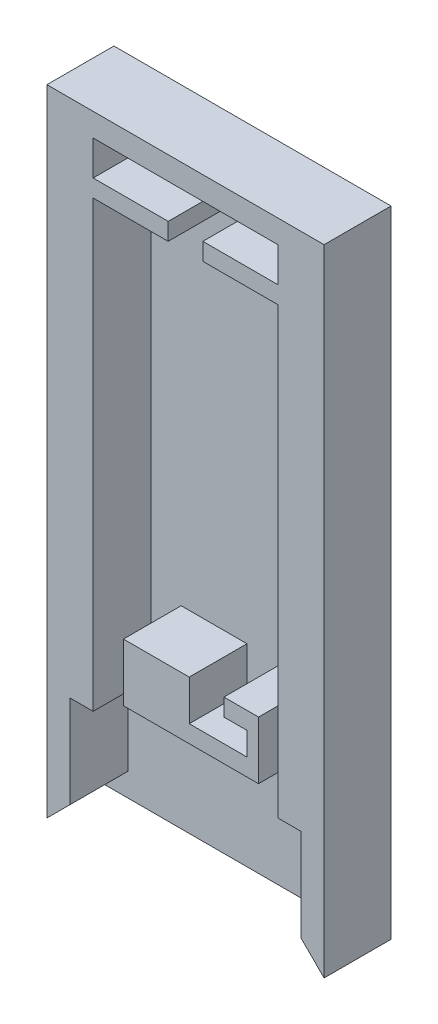
ISO-10303-21;
HEADER;
FILE_DESCRIPTION(('STEP AP214'),'2;1');
FILE_NAME('part.step','',(''),(''),'','','');
FILE_SCHEMA(('AUTOMOTIVE_DESIGN { 1 0 10303 214 1 1 1 1 }'));
ENDSEC;
DATA;
#1=APPLICATION_CONTEXT('core data for automotive mechanical design processes');
#2=APPLICATION_PROTOCOL_DEFINITION('international standard','automotive_design',2000,#1);
#3=PRODUCT_CONTEXT('',#1,'mechanical');
#4=PRODUCT('Part','Part','',(#3));
#5=PRODUCT_RELATED_PRODUCT_CATEGORY('part','',(#4));
#6=PRODUCT_DEFINITION_FORMATION('','',#4);
#7=PRODUCT_DEFINITION_CONTEXT('part definition',#1,'design');
#8=PRODUCT_DEFINITION('design','',#6,#7);
#9=PRODUCT_DEFINITION_SHAPE('','',#8);
#10=(LENGTH_UNIT() NAMED_UNIT(*) SI_UNIT(.MILLI.,.METRE.));
#11=(NAMED_UNIT(*) PLANE_ANGLE_UNIT() SI_UNIT($,.RADIAN.));
#12=(NAMED_UNIT(*) SI_UNIT($,.STERADIAN.) SOLID_ANGLE_UNIT());
#13=UNCERTAINTY_MEASURE_WITH_UNIT(LENGTH_MEASURE(1.E-05),#10,'distance_accuracy_value','');
#14=(GEOMETRIC_REPRESENTATION_CONTEXT(3) GLOBAL_UNCERTAINTY_ASSIGNED_CONTEXT((#13)) GLOBAL_UNIT_ASSIGNED_CONTEXT((#10,
#11,#12)) REPRESENTATION_CONTEXT('',''));
#15=CARTESIAN_POINT('',(0.,0.,0.));
#16=DIRECTION('',(0.,0.,1.));
#17=DIRECTION('',(1.,0.,0.));
#18=AXIS2_PLACEMENT_3D('',#15,#16,#17);
#19=CARTESIAN_POINT('',(0.,0.,1.37625734667575));
#20=DIRECTION('',(0.,0.,1.));
#21=DIRECTION('',(1.,0.,0.));
#22=AXIS2_PLACEMENT_3D('',#19,#20,#21);
#23=PLANE('',#22);
#24=DIRECTION('',(-1.,0.,0.));
#25=VECTOR('',#24,1.);
#26=CARTESIAN_POINT('',(8.,18.109227634733,1.37625734667575));
#27=LINE('',#26,#25);
#28=CARTESIAN_POINT('',(13.7,18.109227634733,1.37625734667575));
#29=VERTEX_POINT('',#28);
#30=CARTESIAN_POINT('',(8.,18.109227634733,1.37625734667575));
#31=VERTEX_POINT('',#30);
#32=EDGE_CURVE('E128',#29,#31,#27,.T.);
#33=ORIENTED_EDGE('',*,*,#32,.F.);
#34=DIRECTION('',(0.,1.,0.));
#35=VECTOR('',#34,1.);
#36=CARTESIAN_POINT('',(13.7,18.109227634733,1.37625734667575));
#37=LINE('',#36,#35);
#38=CARTESIAN_POINT('',(13.7,14.609227634733,1.37625734667575));
#39=VERTEX_POINT('',#38);
#40=EDGE_CURVE('E138',#39,#29,#37,.T.);
#41=ORIENTED_EDGE('',*,*,#40,.F.);
#42=DIRECTION('',(-1.,0.,0.));
#43=VECTOR('',#42,1.);
#44=CARTESIAN_POINT('',(18.7,14.609227634733,1.37625734667575));
#45=LINE('',#44,#43);
#46=CARTESIAN_POINT('',(18.7,14.609227634733,1.37625734667575));
#47=VERTEX_POINT('',#46);
#48=EDGE_CURVE('E151',#47,#39,#45,.T.);
#49=ORIENTED_EDGE('',*,*,#48,.F.);
#50=DIRECTION('',(0.,-1.,0.));
#51=VECTOR('',#50,1.);
#52=CARTESIAN_POINT('',(18.7,16.609227634733,1.37625734667575));
#53=LINE('',#52,#51);
#54=CARTESIAN_POINT('',(18.7,16.609227634733,1.37625734667575));
#55=VERTEX_POINT('',#54);
#56=EDGE_CURVE('E153',#55,#47,#53,.T.);
#57=ORIENTED_EDGE('',*,*,#56,.F.);
#58=DIRECTION('',(1.,0.,0.));
#59=VECTOR('',#58,1.);
#60=CARTESIAN_POINT('',(16.7,16.609227634733,1.37625734667575));
#61=LINE('',#60,#59);
#62=CARTESIAN_POINT('',(16.7,16.609227634733,1.37625734667575));
#63=VERTEX_POINT('',#62);
#64=EDGE_CURVE('E155',#63,#55,#61,.T.);
#65=ORIENTED_EDGE('',*,*,#64,.F.);
#66=DIRECTION('',(0.,-1.,0.));
#67=VECTOR('',#66,1.);
#68=CARTESIAN_POINT('',(16.7,18.109227634733,1.37625734667575));
#69=LINE('',#68,#67);
#70=CARTESIAN_POINT('',(16.7,18.109227634733,1.37625734667575));
#71=VERTEX_POINT('',#70);
#72=EDGE_CURVE('E157',#71,#63,#69,.T.);
#73=ORIENTED_EDGE('',*,*,#72,.F.);
#74=DIRECTION('',(-1.,0.,0.));
#75=VECTOR('',#74,1.);
#76=CARTESIAN_POINT('',(16.7,18.109227634733,1.37625734667575));
#77=LINE('',#76,#75);
#78=CARTESIAN_POINT('',(19.7,18.109227634733,1.37625734667575));
#79=VERTEX_POINT('',#78);
#80=EDGE_CURVE('E159',#79,#71,#77,.T.);
#81=ORIENTED_EDGE('',*,*,#80,.F.);
#82=DIRECTION('',(0.,1.,0.));
#83=VECTOR('',#82,1.);
#84=CARTESIAN_POINT('',(19.7,18.109227634733,1.37625734667575));
#85=LINE('',#84,#83);
#86=CARTESIAN_POINT('',(19.7,13.109227634733,1.37625734667575));
#87=VERTEX_POINT('',#86);
#88=EDGE_CURVE('E161',#87,#79,#85,.T.);
#89=ORIENTED_EDGE('',*,*,#88,.F.);
#90=DIRECTION('',(1.,0.,0.));
#91=VECTOR('',#90,1.);
#92=CARTESIAN_POINT('',(8.,13.109227634733,1.37625734667575));
#93=LINE('',#92,#91);
#94=CARTESIAN_POINT('',(8.,13.109227634733,1.37625734667575));
#95=VERTEX_POINT('',#94);
#96=EDGE_CURVE('E58',#95,#87,#93,.T.);
#97=ORIENTED_EDGE('',*,*,#96,.F.);
#98=DIRECTION('',(0.,-1.,0.));
#99=VECTOR('',#98,1.);
#100=CARTESIAN_POINT('',(8.,18.109227634733,1.37625734667575));
#101=LINE('',#100,#99);
#102=EDGE_CURVE('E13',#31,#95,#101,.T.);
#103=ORIENTED_EDGE('',*,*,#102,.F.);
#104=EDGE_LOOP('',(#33,#41,#49,#57,#65,#73,#81,#89,#97,#103));
#105=FACE_BOUND('',#104,.T.);
#106=ADVANCED_FACE('F50',(#105),#23,.F.);
#107=CARTESIAN_POINT('',(8.,13.109227634733,6.37625734667575));
#108=DIRECTION('',(0.,1.,0.));
#109=DIRECTION('',(0.,0.,1.));
#110=AXIS2_PLACEMENT_3D('',#107,#108,#109);
#111=PLANE('',#110);
#112=ORIENTED_EDGE('',*,*,#96,.T.);
#113=DIRECTION('',(0.,0.,-1.));
#114=VECTOR('',#113,1.);
#115=CARTESIAN_POINT('',(19.7,13.109227634733,6.37625734667575));
#116=LINE('',#115,#114);
#117=CARTESIAN_POINT('',(19.7,13.109227634733,6.37625734667575));
#118=VERTEX_POINT('',#117);
#119=EDGE_CURVE('E180',#118,#87,#116,.T.);
#120=ORIENTED_EDGE('',*,*,#119,.F.);
#121=DIRECTION('',(1.,0.,0.));
#122=VECTOR('',#121,1.);
#123=CARTESIAN_POINT('',(8.,13.109227634733,6.37625734667575));
#124=LINE('',#123,#122);
#125=CARTESIAN_POINT('',(8.,13.109227634733,6.37625734667575));
#126=VERTEX_POINT('',#125);
#127=EDGE_CURVE('E176',#126,#118,#124,.T.);
#128=ORIENTED_EDGE('',*,*,#127,.F.);
#129=DIRECTION('',(0.,0.,-1.));
#130=VECTOR('',#129,1.);
#131=CARTESIAN_POINT('',(8.,13.109227634733,6.37625734667575));
#132=LINE('',#131,#130);
#133=EDGE_CURVE('E179',#126,#95,#132,.T.);
#134=ORIENTED_EDGE('',*,*,#133,.T.);
#135=EDGE_LOOP('',(#112,#120,#128,#134));
#136=FACE_BOUND('',#135,.T.);
#137=ADVANCED_FACE('F232',(#136),#111,.F.);
#138=CARTESIAN_POINT('',(19.7,18.109227634733,6.37625734667575));
#139=DIRECTION('',(-1.,0.,0.));
#140=DIRECTION('',(0.,-1.,0.));
#141=AXIS2_PLACEMENT_3D('',#138,#139,#140);
#142=PLANE('',#141);
#143=ORIENTED_EDGE('',*,*,#88,.T.);
#144=DIRECTION('',(0.,0.,-1.));
#145=VECTOR('',#144,1.);
#146=CARTESIAN_POINT('',(19.7,18.109227634733,6.37625734667575));
#147=LINE('',#146,#145);
#148=CARTESIAN_POINT('',(19.7,18.109227634733,6.37625734667575));
#149=VERTEX_POINT('',#148);
#150=EDGE_CURVE('E183',#149,#79,#147,.T.);
#151=ORIENTED_EDGE('',*,*,#150,.F.);
#152=DIRECTION('',(0.,1.,0.));
#153=VECTOR('',#152,1.);
#154=CARTESIAN_POINT('',(19.7,18.109227634733,6.37625734667575));
#155=LINE('',#154,#153);
#156=EDGE_CURVE('E175',#118,#149,#155,.T.);
#157=ORIENTED_EDGE('',*,*,#156,.F.);
#158=ORIENTED_EDGE('',*,*,#119,.T.);
#159=EDGE_LOOP('',(#143,#151,#157,#158));
#160=FACE_BOUND('',#159,.T.);
#161=ADVANCED_FACE('F231',(#160),#142,.F.);
#162=CARTESIAN_POINT('',(16.7,18.109227634733,6.37625734667575));
#163=DIRECTION('',(0.,-1.,0.));
#164=DIRECTION('',(0.,0.,-1.));
#165=AXIS2_PLACEMENT_3D('',#162,#163,#164);
#166=PLANE('',#165);
#167=ORIENTED_EDGE('',*,*,#80,.T.);
#168=DIRECTION('',(0.,0.,-1.));
#169=VECTOR('',#168,1.);
#170=CARTESIAN_POINT('',(16.7,18.109227634733,6.37625734667575));
#171=LINE('',#170,#169);
#172=CARTESIAN_POINT('',(16.7,18.109227634733,6.37625734667575));
#173=VERTEX_POINT('',#172);
#174=EDGE_CURVE('E188',#173,#71,#171,.T.);
#175=ORIENTED_EDGE('',*,*,#174,.F.);
#176=DIRECTION('',(-1.,0.,0.));
#177=VECTOR('',#176,1.);
#178=CARTESIAN_POINT('',(16.7,18.109227634733,6.37625734667575));
#179=LINE('',#178,#177);
#180=EDGE_CURVE('E173',#149,#173,#179,.T.);
#181=ORIENTED_EDGE('',*,*,#180,.F.);
#182=ORIENTED_EDGE('',*,*,#150,.T.);
#183=EDGE_LOOP('',(#167,#175,#181,#182));
#184=FACE_BOUND('',#183,.T.);
#185=ADVANCED_FACE('F228',(#184),#166,.F.);
#186=CARTESIAN_POINT('',(16.7,18.109227634733,6.37625734667575));
#187=DIRECTION('',(1.,0.,0.));
#188=DIRECTION('',(0.,0.,-1.));
#189=AXIS2_PLACEMENT_3D('',#186,#187,#188);
#190=PLANE('',#189);
#191=ORIENTED_EDGE('',*,*,#72,.T.);
#192=DIRECTION('',(0.,0.,-1.));
#193=VECTOR('',#192,1.);
#194=CARTESIAN_POINT('',(16.7,16.609227634733,6.37625734667575));
#195=LINE('',#194,#193);
#196=CARTESIAN_POINT('',(16.7,16.609227634733,6.37625734667575));
#197=VERTEX_POINT('',#196);
#198=EDGE_CURVE('E191',#197,#63,#195,.T.);
#199=ORIENTED_EDGE('',*,*,#198,.F.);
#200=DIRECTION('',(0.,-1.,0.));
#201=VECTOR('',#200,1.);
#202=CARTESIAN_POINT('',(16.7,18.109227634733,6.37625734667575));
#203=LINE('',#202,#201);
#204=EDGE_CURVE('E171',#173,#197,#203,.T.);
#205=ORIENTED_EDGE('',*,*,#204,.F.);
#206=ORIENTED_EDGE('',*,*,#174,.T.);
#207=EDGE_LOOP('',(#191,#199,#205,#206));
#208=FACE_BOUND('',#207,.T.);
#209=ADVANCED_FACE('F222',(#208),#190,.F.);
#210=CARTESIAN_POINT('',(16.7,16.609227634733,6.37625734667575));
#211=DIRECTION('',(0.,1.,0.));
#212=DIRECTION('',(0.,0.,1.));
#213=AXIS2_PLACEMENT_3D('',#210,#211,#212);
#214=PLANE('',#213);
#215=ORIENTED_EDGE('',*,*,#64,.T.);
#216=DIRECTION('',(0.,0.,-1.));
#217=VECTOR('',#216,1.);
#218=CARTESIAN_POINT('',(18.7,16.609227634733,6.37625734667575));
#219=LINE('',#218,#217);
#220=CARTESIAN_POINT('',(18.7,16.609227634733,6.37625734667575));
#221=VERTEX_POINT('',#220);
#222=EDGE_CURVE('E194',#221,#55,#219,.T.);
#223=ORIENTED_EDGE('',*,*,#222,.F.);
#224=DIRECTION('',(1.,0.,0.));
#225=VECTOR('',#224,1.);
#226=CARTESIAN_POINT('',(16.7,16.609227634733,6.37625734667575));
#227=LINE('',#226,#225);
#228=EDGE_CURVE('E169',#197,#221,#227,.T.);
#229=ORIENTED_EDGE('',*,*,#228,.F.);
#230=ORIENTED_EDGE('',*,*,#198,.T.);
#231=EDGE_LOOP('',(#215,#223,#229,#230));
#232=FACE_BOUND('',#231,.T.);
#233=ADVANCED_FACE('F218',(#232),#214,.F.);
#234=CARTESIAN_POINT('',(18.7,16.609227634733,6.37625734667575));
#235=DIRECTION('',(1.,0.,0.));
#236=DIRECTION('',(0.,1.,0.));
#237=AXIS2_PLACEMENT_3D('',#234,#235,#236);
#238=PLANE('',#237);
#239=ORIENTED_EDGE('',*,*,#56,.T.);
#240=DIRECTION('',(0.,0.,-1.));
#241=VECTOR('',#240,1.);
#242=CARTESIAN_POINT('',(18.7,14.609227634733,6.37625734667575));
#243=LINE('',#242,#241);
#244=CARTESIAN_POINT('',(18.7,14.609227634733,6.37625734667575));
#245=VERTEX_POINT('',#244);
#246=EDGE_CURVE('E197',#245,#47,#243,.T.);
#247=ORIENTED_EDGE('',*,*,#246,.F.);
#248=DIRECTION('',(0.,-1.,0.));
#249=VECTOR('',#248,1.);
#250=CARTESIAN_POINT('',(18.7,16.609227634733,6.37625734667575));
#251=LINE('',#250,#249);
#252=EDGE_CURVE('E167',#221,#245,#251,.T.);
#253=ORIENTED_EDGE('',*,*,#252,.F.);
#254=ORIENTED_EDGE('',*,*,#222,.T.);
#255=EDGE_LOOP('',(#239,#247,#253,#254));
#256=FACE_BOUND('',#255,.T.);
#257=ADVANCED_FACE('F215',(#256),#238,.F.);
#258=CARTESIAN_POINT('',(18.7,14.609227634733,6.37625734667575));
#259=DIRECTION('',(0.,-1.,0.));
#260=DIRECTION('',(0.,0.,-1.));
#261=AXIS2_PLACEMENT_3D('',#258,#259,#260);
#262=PLANE('',#261);
#263=ORIENTED_EDGE('',*,*,#48,.T.);
#264=DIRECTION('',(0.,0.,-1.));
#265=VECTOR('',#264,1.);
#266=CARTESIAN_POINT('',(13.7,14.609227634733,6.37625734667575));
#267=LINE('',#266,#265);
#268=CARTESIAN_POINT('',(13.7,14.609227634733,6.37625734667575));
#269=VERTEX_POINT('',#268);
#270=EDGE_CURVE('E146',#269,#39,#267,.T.);
#271=ORIENTED_EDGE('',*,*,#270,.F.);
#272=DIRECTION('',(-1.,0.,0.));
#273=VECTOR('',#272,1.);
#274=CARTESIAN_POINT('',(18.7,14.609227634733,6.37625734667575));
#275=LINE('',#274,#273);
#276=EDGE_CURVE('E165',#245,#269,#275,.T.);
#277=ORIENTED_EDGE('',*,*,#276,.F.);
#278=ORIENTED_EDGE('',*,*,#246,.T.);
#279=EDGE_LOOP('',(#263,#271,#277,#278));
#280=FACE_BOUND('',#279,.T.);
#281=ADVANCED_FACE('F206',(#280),#262,.F.);
#282=CARTESIAN_POINT('',(13.7,18.109227634733,6.37625734667575));
#283=DIRECTION('',(-1.,0.,0.));
#284=DIRECTION('',(0.,0.,1.));
#285=AXIS2_PLACEMENT_3D('',#282,#283,#284);
#286=PLANE('',#285);
#287=ORIENTED_EDGE('',*,*,#40,.T.);
#288=DIRECTION('',(0.,0.,-1.));
#289=VECTOR('',#288,1.);
#290=CARTESIAN_POINT('',(13.7,18.109227634733,6.37625734667575));
#291=LINE('',#290,#289);
#292=CARTESIAN_POINT('',(13.7,18.109227634733,6.37625734667575));
#293=VERTEX_POINT('',#292);
#294=EDGE_CURVE('E137',#293,#29,#291,.T.);
#295=ORIENTED_EDGE('',*,*,#294,.F.);
#296=DIRECTION('',(0.,1.,0.));
#297=VECTOR('',#296,1.);
#298=CARTESIAN_POINT('',(13.7,17.909227634733,6.37625734667575));
#299=LINE('',#298,#297);
#300=EDGE_CURVE('E144',#269,#293,#299,.T.);
#301=ORIENTED_EDGE('',*,*,#300,.F.);
#302=ORIENTED_EDGE('',*,*,#270,.T.);
#303=EDGE_LOOP('',(#287,#295,#301,#302));
#304=FACE_BOUND('',#303,.T.);
#305=ADVANCED_FACE('F203',(#304),#286,.F.);
#306=CARTESIAN_POINT('',(0.,0.,6.37625734667575));
#307=DIRECTION('',(0.,0.,1.));
#308=DIRECTION('',(1.,0.,0.));
#309=AXIS2_PLACEMENT_3D('',#306,#307,#308);
#310=PLANE('',#309);
#311=DIRECTION('',(0.,-1.,0.));
#312=VECTOR('',#311,1.);
#313=CARTESIAN_POINT('',(8.,18.109227634733,6.37625734667575));
#314=LINE('',#313,#312);
#315=CARTESIAN_POINT('',(8.,18.109227634733,6.37625734667575));
#316=VERTEX_POINT('',#315);
#317=EDGE_CURVE('E53',#316,#126,#314,.T.);
#318=ORIENTED_EDGE('',*,*,#317,.T.);
#319=ORIENTED_EDGE('',*,*,#127,.T.);
#320=ORIENTED_EDGE('',*,*,#156,.T.);
#321=ORIENTED_EDGE('',*,*,#180,.T.);
#322=ORIENTED_EDGE('',*,*,#204,.T.);
#323=ORIENTED_EDGE('',*,*,#228,.T.);
#324=ORIENTED_EDGE('',*,*,#252,.T.);
#325=ORIENTED_EDGE('',*,*,#276,.T.);
#326=ORIENTED_EDGE('',*,*,#300,.T.);
#327=DIRECTION('',(-1.,0.,0.));
#328=VECTOR('',#327,1.);
#329=CARTESIAN_POINT('',(8.,18.109227634733,6.37625734667575));
#330=LINE('',#329,#328);
#331=EDGE_CURVE('E142',#293,#316,#330,.T.);
#332=ORIENTED_EDGE('',*,*,#331,.T.);
#333=EDGE_LOOP('',(#318,#319,#320,#321,#322,#323,#324,#325,#326,#332));
#334=FACE_BOUND('',#333,.T.);
#335=ADVANCED_FACE('F178',(#334),#310,.T.);
#336=CARTESIAN_POINT('',(8.,18.109227634733,6.37625734667575));
#337=DIRECTION('',(1.,0.,0.));
#338=DIRECTION('',(0.,0.,-1.));
#339=AXIS2_PLACEMENT_3D('',#336,#337,#338);
#340=PLANE('',#339);
#341=ORIENTED_EDGE('',*,*,#102,.T.);
#342=ORIENTED_EDGE('',*,*,#133,.F.);
#343=ORIENTED_EDGE('',*,*,#317,.F.);
#344=DIRECTION('',(0.,0.,-1.));
#345=VECTOR('',#344,1.);
#346=CARTESIAN_POINT('',(8.,18.109227634733,6.37625734667575));
#347=LINE('',#346,#345);
#348=EDGE_CURVE('E134',#316,#31,#347,.T.);
#349=ORIENTED_EDGE('',*,*,#348,.T.);
#350=EDGE_LOOP('',(#341,#342,#343,#349));
#351=FACE_BOUND('',#350,.T.);
#352=ADVANCED_FACE('F140',(#351),#340,.F.);
#353=CARTESIAN_POINT('',(8.,18.109227634733,6.37625734667575));
#354=DIRECTION('',(0.,-1.,0.));
#355=DIRECTION('',(0.,0.,-1.));
#356=AXIS2_PLACEMENT_3D('',#353,#354,#355);
#357=PLANE('',#356);
#358=ORIENTED_EDGE('',*,*,#32,.T.);
#359=ORIENTED_EDGE('',*,*,#348,.F.);
#360=ORIENTED_EDGE('',*,*,#331,.F.);
#361=ORIENTED_EDGE('',*,*,#294,.T.);
#362=EDGE_LOOP('',(#358,#359,#360,#361));
#363=FACE_BOUND('',#362,.T.);
#364=ADVANCED_FACE('F132',(#363),#357,.F.);
#365=CLOSED_SHELL('',(#106,#137,#161,#185,#209,#233,#257,#281,#305,#335,#352,#364));
#366=MANIFOLD_SOLID_BREP('B2',#365);
#367=CARTESIAN_POINT('',(0.,0.,5.));
#368=DIRECTION('',(-0.707106781186548,0.707106781186548,0.));
#369=DIRECTION('',(-0.707106781186548,-0.707106781186548,0.));
#370=AXIS2_PLACEMENT_3D('',#367,#368,#369);
#371=PLANE('',#370);
#372=DIRECTION('',(0.707106781186548,0.707106781186548,0.));
#373=VECTOR('',#372,1.);
#374=CARTESIAN_POINT('',(0.,0.,0.));
#375=LINE('',#374,#373);
#376=CARTESIAN_POINT('',(0.,0.,0.));
#377=VERTEX_POINT('',#376);
#378=CARTESIAN_POINT('',(2.,2.,0.));
#379=VERTEX_POINT('',#378);
#380=EDGE_CURVE('E48',#377,#379,#375,.T.);
#381=ORIENTED_EDGE('',*,*,#380,.T.);
#382=DIRECTION('',(0.,0.,-1.));
#383=VECTOR('',#382,1.);
#384=CARTESIAN_POINT('',(2.,2.,5.));
#385=LINE('',#384,#383);
#386=CARTESIAN_POINT('',(2.,2.,5.));
#387=VERTEX_POINT('',#386);
#388=EDGE_CURVE('E539',#387,#379,#385,.T.);
#389=ORIENTED_EDGE('',*,*,#388,.F.);
#390=DIRECTION('',(0.707106781186548,0.707106781186548,0.));
#391=VECTOR('',#390,1.);
#392=CARTESIAN_POINT('',(0.,0.,5.));
#393=LINE('',#392,#391);
#394=CARTESIAN_POINT('',(0.,0.,5.));
#395=VERTEX_POINT('',#394);
#396=EDGE_CURVE('E383',#395,#387,#393,.T.);
#397=ORIENTED_EDGE('',*,*,#396,.F.);
#398=DIRECTION('',(0.,0.,-1.));
#399=VECTOR('',#398,1.);
#400=CARTESIAN_POINT('',(0.,0.,5.));
#401=LINE('',#400,#399);
#402=EDGE_CURVE('E565',#395,#377,#401,.T.);
#403=ORIENTED_EDGE('',*,*,#402,.T.);
#404=EDGE_LOOP('',(#381,#389,#397,#403));
#405=FACE_BOUND('',#404,.T.);
#406=ADVANCED_FACE('F379',(#405),#371,.F.);
#407=CARTESIAN_POINT('',(2.,2.,5.));
#408=DIRECTION('',(-1.,0.,0.));
#409=DIRECTION('',(0.,0.,1.));
#410=AXIS2_PLACEMENT_3D('',#407,#408,#409);
#411=PLANE('',#410);
#412=DIRECTION('',(0.,1.,0.));
#413=VECTOR('',#412,1.);
#414=CARTESIAN_POINT('',(2.,2.,0.));
#415=LINE('',#414,#413);
#416=CARTESIAN_POINT('',(2.,10.,0.));
#417=VERTEX_POINT('',#416);
#418=EDGE_CURVE('E388',#379,#417,#415,.T.);
#419=ORIENTED_EDGE('',*,*,#418,.T.);
#420=DIRECTION('',(0.,0.,-1.));
#421=VECTOR('',#420,1.);
#422=CARTESIAN_POINT('',(2.,10.,5.));
#423=LINE('',#422,#421);
#424=CARTESIAN_POINT('',(2.,10.,5.));
#425=VERTEX_POINT('',#424);
#426=EDGE_CURVE('E650',#425,#417,#423,.T.);
#427=ORIENTED_EDGE('',*,*,#426,.F.);
#428=DIRECTION('',(0.,1.,0.));
#429=VECTOR('',#428,1.);
#430=CARTESIAN_POINT('',(2.,2.,5.));
#431=LINE('',#430,#429);
#432=EDGE_CURVE('E402',#387,#425,#431,.T.);
#433=ORIENTED_EDGE('',*,*,#432,.F.);
#434=ORIENTED_EDGE('',*,*,#388,.T.);
#435=EDGE_LOOP('',(#419,#427,#433,#434));
#436=FACE_BOUND('',#435,.T.);
#437=ADVANCED_FACE('F748',(#436),#411,.F.);
#438=CARTESIAN_POINT('',(2.,10.,5.));
#439=DIRECTION('',(0.,1.,0.));
#440=DIRECTION('',(0.,0.,1.));
#441=AXIS2_PLACEMENT_3D('',#438,#439,#440);
#442=PLANE('',#441);
#443=DIRECTION('',(1.,0.,0.));
#444=VECTOR('',#443,1.);
#445=CARTESIAN_POINT('',(2.,10.,0.));
#446=LINE('',#445,#444);
#447=CARTESIAN_POINT('',(4.,10.,0.));
#448=VERTEX_POINT('',#447);
#449=EDGE_CURVE('E606',#417,#448,#446,.T.);
#450=ORIENTED_EDGE('',*,*,#449,.T.);
#451=DIRECTION('',(0.,0.,-1.));
#452=VECTOR('',#451,1.);
#453=CARTESIAN_POINT('',(4.,10.,5.));
#454=LINE('',#453,#452);
#455=CARTESIAN_POINT('',(4.,10.,5.));
#456=VERTEX_POINT('',#455);
#457=EDGE_CURVE('E653',#456,#448,#454,.T.);
#458=ORIENTED_EDGE('',*,*,#457,.F.);
#459=DIRECTION('',(1.,0.,0.));
#460=VECTOR('',#459,1.);
#461=CARTESIAN_POINT('',(2.,10.,5.));
#462=LINE('',#461,#460);
#463=EDGE_CURVE('E643',#425,#456,#462,.T.);
#464=ORIENTED_EDGE('',*,*,#463,.F.);
#465=ORIENTED_EDGE('',*,*,#426,.T.);
#466=EDGE_LOOP('',(#450,#458,#464,#465));
#467=FACE_BOUND('',#466,.T.);
#468=ADVANCED_FACE('F747',(#467),#442,.F.);
#469=CARTESIAN_POINT('',(4.,10.,5.));
#470=DIRECTION('',(-1.,0.,0.));
#471=DIRECTION('',(0.,0.,1.));
#472=AXIS2_PLACEMENT_3D('',#469,#470,#471);
#473=PLANE('',#472);
#474=DIRECTION('',(0.,1.,0.));
#475=VECTOR('',#474,1.);
#476=CARTESIAN_POINT('',(4.,10.,0.));
#477=LINE('',#476,#475);
#478=CARTESIAN_POINT('',(4.,48.5,0.));
#479=VERTEX_POINT('',#478);
#480=EDGE_CURVE('E603',#448,#479,#477,.T.);
#481=ORIENTED_EDGE('',*,*,#480,.T.);
#482=DIRECTION('',(0.,0.,-1.));
#483=VECTOR('',#482,1.);
#484=CARTESIAN_POINT('',(4.,48.5,5.));
#485=LINE('',#484,#483);
#486=CARTESIAN_POINT('',(4.,48.5,5.));
#487=VERTEX_POINT('',#486);
#488=EDGE_CURVE('E660',#487,#479,#485,.T.);
#489=ORIENTED_EDGE('',*,*,#488,.F.);
#490=DIRECTION('',(0.,1.,0.));
#491=VECTOR('',#490,1.);
#492=CARTESIAN_POINT('',(4.,10.,5.));
#493=LINE('',#492,#491);
#494=EDGE_CURVE('E641',#456,#487,#493,.T.);
#495=ORIENTED_EDGE('',*,*,#494,.F.);
#496=ORIENTED_EDGE('',*,*,#457,.T.);
#497=EDGE_LOOP('',(#481,#489,#495,#496));
#498=FACE_BOUND('',#497,.T.);
#499=ADVANCED_FACE('F742',(#498),#473,.F.);
#500=CARTESIAN_POINT('',(4.,48.5,5.));
#501=DIRECTION('',(0.,1.,0.));
#502=DIRECTION('',(-1.,0.,0.));
#503=AXIS2_PLACEMENT_3D('',#500,#501,#502);
#504=PLANE('',#503);
#505=DIRECTION('',(1.,0.,0.));
#506=VECTOR('',#505,1.);
#507=CARTESIAN_POINT('',(4.,48.5,0.));
#508=LINE('',#507,#506);
#509=CARTESIAN_POINT('',(10.5,48.5,0.));
#510=VERTEX_POINT('',#509);
#511=EDGE_CURVE('E600',#479,#510,#508,.T.);
#512=ORIENTED_EDGE('',*,*,#511,.T.);
#513=DIRECTION('',(0.,0.,-1.));
#514=VECTOR('',#513,1.);
#515=CARTESIAN_POINT('',(10.5,48.5,5.));
#516=LINE('',#515,#514);
#517=CARTESIAN_POINT('',(10.5,48.5,5.));
#518=VERTEX_POINT('',#517);
#519=EDGE_CURVE('E663',#518,#510,#516,.T.);
#520=ORIENTED_EDGE('',*,*,#519,.F.);
#521=DIRECTION('',(1.,0.,0.));
#522=VECTOR('',#521,1.);
#523=CARTESIAN_POINT('',(4.,48.5,5.));
#524=LINE('',#523,#522);
#525=EDGE_CURVE('E639',#487,#518,#524,.T.);
#526=ORIENTED_EDGE('',*,*,#525,.F.);
#527=ORIENTED_EDGE('',*,*,#488,.T.);
#528=EDGE_LOOP('',(#512,#520,#526,#527));
#529=FACE_BOUND('',#528,.T.);
#530=ADVANCED_FACE('F739',(#529),#504,.F.);
#531=CARTESIAN_POINT('',(10.5,50.,5.));
#532=DIRECTION('',(-1.,0.,0.));
#533=DIRECTION('',(0.,0.,1.));
#534=AXIS2_PLACEMENT_3D('',#531,#532,#533);
#535=PLANE('',#534);
#536=DIRECTION('',(0.,1.,0.));
#537=VECTOR('',#536,1.);
#538=CARTESIAN_POINT('',(10.5,50.,0.));
#539=LINE('',#538,#537);
#540=CARTESIAN_POINT('',(10.5,50.,0.));
#541=VERTEX_POINT('',#540);
#542=EDGE_CURVE('E597',#510,#541,#539,.T.);
#543=ORIENTED_EDGE('',*,*,#542,.T.);
#544=DIRECTION('',(0.,0.,-1.));
#545=VECTOR('',#544,1.);
#546=CARTESIAN_POINT('',(10.5,50.,5.));
#547=LINE('',#546,#545);
#548=CARTESIAN_POINT('',(10.5,50.,5.));
#549=VERTEX_POINT('',#548);
#550=EDGE_CURVE('E666',#549,#541,#547,.T.);
#551=ORIENTED_EDGE('',*,*,#550,.F.);
#552=DIRECTION('',(0.,1.,0.));
#553=VECTOR('',#552,1.);
#554=CARTESIAN_POINT('',(10.5,50.,5.));
#555=LINE('',#554,#553);
#556=EDGE_CURVE('E637',#518,#549,#555,.T.);
#557=ORIENTED_EDGE('',*,*,#556,.F.);
#558=ORIENTED_EDGE('',*,*,#519,.T.);
#559=EDGE_LOOP('',(#543,#551,#557,#558));
#560=FACE_BOUND('',#559,.T.);
#561=ADVANCED_FACE('F734',(#560),#535,.F.);
#562=CARTESIAN_POINT('',(4.,50.,5.));
#563=DIRECTION('',(0.,-1.,0.));
#564=DIRECTION('',(0.,0.,-1.));
#565=AXIS2_PLACEMENT_3D('',#562,#563,#564);
#566=PLANE('',#565);
#567=DIRECTION('',(-1.,0.,0.));
#568=VECTOR('',#567,1.);
#569=CARTESIAN_POINT('',(4.,50.,0.));
#570=LINE('',#569,#568);
#571=CARTESIAN_POINT('',(4.,50.,0.));
#572=VERTEX_POINT('',#571);
#573=EDGE_CURVE('E594',#541,#572,#570,.T.);
#574=ORIENTED_EDGE('',*,*,#573,.T.);
#575=DIRECTION('',(0.,0.,-1.));
#576=VECTOR('',#575,1.);
#577=CARTESIAN_POINT('',(4.,50.,5.));
#578=LINE('',#577,#576);
#579=CARTESIAN_POINT('',(4.,50.,5.));
#580=VERTEX_POINT('',#579);
#581=EDGE_CURVE('E669',#580,#572,#578,.T.);
#582=ORIENTED_EDGE('',*,*,#581,.F.);
#583=DIRECTION('',(-1.,0.,0.));
#584=VECTOR('',#583,1.);
#585=CARTESIAN_POINT('',(4.,50.,5.));
#586=LINE('',#585,#584);
#587=EDGE_CURVE('E635',#549,#580,#586,.T.);
#588=ORIENTED_EDGE('',*,*,#587,.F.);
#589=ORIENTED_EDGE('',*,*,#550,.T.);
#590=EDGE_LOOP('',(#574,#582,#588,#589));
#591=FACE_BOUND('',#590,.T.);
#592=ADVANCED_FACE('F731',(#591),#566,.F.);
#593=CARTESIAN_POINT('',(4.,50.,5.));
#594=DIRECTION('',(-1.,0.,0.));
#595=DIRECTION('',(0.,0.,1.));
#596=AXIS2_PLACEMENT_3D('',#593,#594,#595);
#597=PLANE('',#596);
#598=DIRECTION('',(0.,1.,0.));
#599=VECTOR('',#598,1.);
#600=CARTESIAN_POINT('',(4.,50.,0.));
#601=LINE('',#600,#599);
#602=CARTESIAN_POINT('',(4.,53.,0.));
#603=VERTEX_POINT('',#602);
#604=EDGE_CURVE('E591',#572,#603,#601,.T.);
#605=ORIENTED_EDGE('',*,*,#604,.T.);
#606=DIRECTION('',(0.,0.,-1.));
#607=VECTOR('',#606,1.);
#608=CARTESIAN_POINT('',(4.,53.,5.));
#609=LINE('',#608,#607);
#610=CARTESIAN_POINT('',(4.,53.,5.));
#611=VERTEX_POINT('',#610);
#612=EDGE_CURVE('E672',#611,#603,#609,.T.);
#613=ORIENTED_EDGE('',*,*,#612,.F.);
#614=DIRECTION('',(0.,1.,0.));
#615=VECTOR('',#614,1.);
#616=CARTESIAN_POINT('',(4.,50.,5.));
#617=LINE('',#616,#615);
#618=EDGE_CURVE('E633',#580,#611,#617,.T.);
#619=ORIENTED_EDGE('',*,*,#618,.F.);
#620=ORIENTED_EDGE('',*,*,#581,.T.);
#621=EDGE_LOOP('',(#605,#613,#619,#620));
#622=FACE_BOUND('',#621,.T.);
#623=ADVANCED_FACE('F726',(#622),#597,.F.);
#624=CARTESIAN_POINT('',(4.,53.,5.));
#625=DIRECTION('',(0.,1.,0.));
#626=DIRECTION('',(0.,0.,1.));
#627=AXIS2_PLACEMENT_3D('',#624,#625,#626);
#628=PLANE('',#627);
#629=DIRECTION('',(1.,0.,0.));
#630=VECTOR('',#629,1.);
#631=CARTESIAN_POINT('',(4.,53.,0.));
#632=LINE('',#631,#630);
#633=CARTESIAN_POINT('',(20.,53.,0.));
#634=VERTEX_POINT('',#633);
#635=EDGE_CURVE('E588',#603,#634,#632,.T.);
#636=ORIENTED_EDGE('',*,*,#635,.T.);
#637=DIRECTION('',(0.,0.,-1.));
#638=VECTOR('',#637,1.);
#639=CARTESIAN_POINT('',(20.,53.,5.));
#640=LINE('',#639,#638);
#641=CARTESIAN_POINT('',(20.,53.,5.));
#642=VERTEX_POINT('',#641);
#643=EDGE_CURVE('E675',#642,#634,#640,.T.);
#644=ORIENTED_EDGE('',*,*,#643,.F.);
#645=DIRECTION('',(1.,0.,0.));
#646=VECTOR('',#645,1.);
#647=CARTESIAN_POINT('',(4.,53.,5.));
#648=LINE('',#647,#646);
#649=EDGE_CURVE('E631',#611,#642,#648,.T.);
#650=ORIENTED_EDGE('',*,*,#649,.F.);
#651=ORIENTED_EDGE('',*,*,#612,.T.);
#652=EDGE_LOOP('',(#636,#644,#650,#651));
#653=FACE_BOUND('',#652,.T.);
#654=ADVANCED_FACE('F723',(#653),#628,.F.);
#655=CARTESIAN_POINT('',(20.,53.,5.));
#656=DIRECTION('',(1.,0.,0.));
#657=DIRECTION('',(0.,0.,-1.));
#658=AXIS2_PLACEMENT_3D('',#655,#656,#657);
#659=PLANE('',#658);
#660=DIRECTION('',(0.,-1.,0.));
#661=VECTOR('',#660,1.);
#662=CARTESIAN_POINT('',(20.,53.,0.));
#663=LINE('',#662,#661);
#664=CARTESIAN_POINT('',(20.,50.,0.));
#665=VERTEX_POINT('',#664);
#666=EDGE_CURVE('E585',#634,#665,#663,.T.);
#667=ORIENTED_EDGE('',*,*,#666,.T.);
#668=DIRECTION('',(0.,0.,-1.));
#669=VECTOR('',#668,1.);
#670=CARTESIAN_POINT('',(20.,50.,5.));
#671=LINE('',#670,#669);
#672=CARTESIAN_POINT('',(20.,50.,5.));
#673=VERTEX_POINT('',#672);
#674=EDGE_CURVE('E678',#673,#665,#671,.T.);
#675=ORIENTED_EDGE('',*,*,#674,.F.);
#676=DIRECTION('',(0.,-1.,0.));
#677=VECTOR('',#676,1.);
#678=CARTESIAN_POINT('',(20.,53.,5.));
#679=LINE('',#678,#677);
#680=EDGE_CURVE('E629',#642,#673,#679,.T.);
#681=ORIENTED_EDGE('',*,*,#680,.F.);
#682=ORIENTED_EDGE('',*,*,#643,.T.);
#683=EDGE_LOOP('',(#667,#675,#681,#682));
#684=FACE_BOUND('',#683,.T.);
#685=ADVANCED_FACE('F718',(#684),#659,.F.);
#686=CARTESIAN_POINT('',(20.,50.,5.));
#687=DIRECTION('',(0.,-1.,0.));
#688=DIRECTION('',(0.,0.,-1.));
#689=AXIS2_PLACEMENT_3D('',#686,#687,#688);
#690=PLANE('',#689);
#691=DIRECTION('',(-1.,0.,0.));
#692=VECTOR('',#691,1.);
#693=CARTESIAN_POINT('',(20.,50.,0.));
#694=LINE('',#693,#692);
#695=CARTESIAN_POINT('',(13.5,50.,0.));
#696=VERTEX_POINT('',#695);
#697=EDGE_CURVE('E582',#665,#696,#694,.T.);
#698=ORIENTED_EDGE('',*,*,#697,.T.);
#699=DIRECTION('',(0.,0.,-1.));
#700=VECTOR('',#699,1.);
#701=CARTESIAN_POINT('',(13.5,50.,5.));
#702=LINE('',#701,#700);
#703=CARTESIAN_POINT('',(13.5,50.,5.));
#704=VERTEX_POINT('',#703);
#705=EDGE_CURVE('E681',#704,#696,#702,.T.);
#706=ORIENTED_EDGE('',*,*,#705,.F.);
#707=DIRECTION('',(-1.,0.,0.));
#708=VECTOR('',#707,1.);
#709=CARTESIAN_POINT('',(20.,50.,5.));
#710=LINE('',#709,#708);
#711=EDGE_CURVE('E627',#673,#704,#710,.T.);
#712=ORIENTED_EDGE('',*,*,#711,.F.);
#713=ORIENTED_EDGE('',*,*,#674,.T.);
#714=EDGE_LOOP('',(#698,#706,#712,#713));
#715=FACE_BOUND('',#714,.T.);
#716=ADVANCED_FACE('F715',(#715),#690,.F.);
#717=CARTESIAN_POINT('',(13.5,50.,5.));
#718=DIRECTION('',(1.,0.,0.));
#719=DIRECTION('',(0.,1.,0.));
#720=AXIS2_PLACEMENT_3D('',#717,#718,#719);
#721=PLANE('',#720);
#722=DIRECTION('',(0.,-1.,0.));
#723=VECTOR('',#722,1.);
#724=CARTESIAN_POINT('',(13.5,50.,0.));
#725=LINE('',#724,#723);
#726=CARTESIAN_POINT('',(13.5,48.5,0.));
#727=VERTEX_POINT('',#726);
#728=EDGE_CURVE('E579',#696,#727,#725,.T.);
#729=ORIENTED_EDGE('',*,*,#728,.T.);
#730=DIRECTION('',(0.,0.,-1.));
#731=VECTOR('',#730,1.);
#732=CARTESIAN_POINT('',(13.5,48.5,5.));
#733=LINE('',#732,#731);
#734=CARTESIAN_POINT('',(13.5,48.5,5.));
#735=VERTEX_POINT('',#734);
#736=EDGE_CURVE('E684',#735,#727,#733,.T.);
#737=ORIENTED_EDGE('',*,*,#736,.F.);
#738=DIRECTION('',(0.,-1.,0.));
#739=VECTOR('',#738,1.);
#740=CARTESIAN_POINT('',(13.5,50.,5.));
#741=LINE('',#740,#739);
#742=EDGE_CURVE('E625',#704,#735,#741,.T.);
#743=ORIENTED_EDGE('',*,*,#742,.F.);
#744=ORIENTED_EDGE('',*,*,#705,.T.);
#745=EDGE_LOOP('',(#729,#737,#743,#744));
#746=FACE_BOUND('',#745,.T.);
#747=ADVANCED_FACE('F710',(#746),#721,.F.);
#748=CARTESIAN_POINT('',(20.,48.5,5.));
#749=DIRECTION('',(0.,1.,0.));
#750=DIRECTION('',(0.,0.,1.));
#751=AXIS2_PLACEMENT_3D('',#748,#749,#750);
#752=PLANE('',#751);
#753=DIRECTION('',(1.,0.,0.));
#754=VECTOR('',#753,1.);
#755=CARTESIAN_POINT('',(20.,48.5,0.));
#756=LINE('',#755,#754);
#757=CARTESIAN_POINT('',(20.,48.5,0.));
#758=VERTEX_POINT('',#757);
#759=EDGE_CURVE('E576',#727,#758,#756,.T.);
#760=ORIENTED_EDGE('',*,*,#759,.T.);
#761=DIRECTION('',(0.,0.,-1.));
#762=VECTOR('',#761,1.);
#763=CARTESIAN_POINT('',(20.,48.5,5.));
#764=LINE('',#763,#762);
#765=CARTESIAN_POINT('',(20.,48.5,5.));
#766=VERTEX_POINT('',#765);
#767=EDGE_CURVE('E687',#766,#758,#764,.T.);
#768=ORIENTED_EDGE('',*,*,#767,.F.);
#769=DIRECTION('',(1.,0.,0.));
#770=VECTOR('',#769,1.);
#771=CARTESIAN_POINT('',(20.,48.5,5.));
#772=LINE('',#771,#770);
#773=EDGE_CURVE('E623',#735,#766,#772,.T.);
#774=ORIENTED_EDGE('',*,*,#773,.F.);
#775=ORIENTED_EDGE('',*,*,#736,.T.);
#776=EDGE_LOOP('',(#760,#768,#774,#775));
#777=FACE_BOUND('',#776,.T.);
#778=ADVANCED_FACE('F707',(#777),#752,.F.);
#779=CARTESIAN_POINT('',(20.,48.5,5.));
#780=DIRECTION('',(1.,0.,0.));
#781=DIRECTION('',(0.,1.,0.));
#782=AXIS2_PLACEMENT_3D('',#779,#780,#781);
#783=PLANE('',#782);
#784=DIRECTION('',(0.,-1.,0.));
#785=VECTOR('',#784,1.);
#786=CARTESIAN_POINT('',(20.,48.5,0.));
#787=LINE('',#786,#785);
#788=CARTESIAN_POINT('',(20.,10.,0.));
#789=VERTEX_POINT('',#788);
#790=EDGE_CURVE('E573',#758,#789,#787,.T.);
#791=ORIENTED_EDGE('',*,*,#790,.T.);
#792=DIRECTION('',(0.,0.,-1.));
#793=VECTOR('',#792,1.);
#794=CARTESIAN_POINT('',(20.,10.,5.));
#795=LINE('',#794,#793);
#796=CARTESIAN_POINT('',(20.,10.,5.));
#797=VERTEX_POINT('',#796);
#798=EDGE_CURVE('E690',#797,#789,#795,.T.);
#799=ORIENTED_EDGE('',*,*,#798,.F.);
#800=DIRECTION('',(0.,-1.,0.));
#801=VECTOR('',#800,1.);
#802=CARTESIAN_POINT('',(20.,48.5,5.));
#803=LINE('',#802,#801);
#804=EDGE_CURVE('E621',#766,#797,#803,.T.);
#805=ORIENTED_EDGE('',*,*,#804,.F.);
#806=ORIENTED_EDGE('',*,*,#767,.T.);
#807=EDGE_LOOP('',(#791,#799,#805,#806));
#808=FACE_BOUND('',#807,.T.);
#809=ADVANCED_FACE('F702',(#808),#783,.F.);
#810=CARTESIAN_POINT('',(20.,10.,5.));
#811=DIRECTION('',(0.,1.,0.));
#812=DIRECTION('',(0.,0.,1.));
#813=AXIS2_PLACEMENT_3D('',#810,#811,#812);
#814=PLANE('',#813);
#815=DIRECTION('',(1.,0.,0.));
#816=VECTOR('',#815,1.);
#817=CARTESIAN_POINT('',(20.,10.,0.));
#818=LINE('',#817,#816);
#819=CARTESIAN_POINT('',(22.,10.,0.));
#820=VERTEX_POINT('',#819);
#821=EDGE_CURVE('E570',#789,#820,#818,.T.);
#822=ORIENTED_EDGE('',*,*,#821,.T.);
#823=DIRECTION('',(0.,0.,-1.));
#824=VECTOR('',#823,1.);
#825=CARTESIAN_POINT('',(22.,10.,5.));
#826=LINE('',#825,#824);
#827=CARTESIAN_POINT('',(22.,10.,5.));
#828=VERTEX_POINT('',#827);
#829=EDGE_CURVE('E560',#828,#820,#826,.T.);
#830=ORIENTED_EDGE('',*,*,#829,.F.);
#831=DIRECTION('',(1.,0.,0.));
#832=VECTOR('',#831,1.);
#833=CARTESIAN_POINT('',(20.,10.,5.));
#834=LINE('',#833,#832);
#835=EDGE_CURVE('E619',#797,#828,#834,.T.);
#836=ORIENTED_EDGE('',*,*,#835,.F.);
#837=ORIENTED_EDGE('',*,*,#798,.T.);
#838=EDGE_LOOP('',(#822,#830,#836,#837));
#839=FACE_BOUND('',#838,.T.);
#840=ADVANCED_FACE('F699',(#839),#814,.F.);
#841=CARTESIAN_POINT('',(22.,2.,5.));
#842=DIRECTION('',(1.,0.,0.));
#843=DIRECTION('',(0.,0.,-1.));
#844=AXIS2_PLACEMENT_3D('',#841,#842,#843);
#845=PLANE('',#844);
#846=DIRECTION('',(0.,-1.,0.));
#847=VECTOR('',#846,1.);
#848=CARTESIAN_POINT('',(22.,2.,0.));
#849=LINE('',#848,#847);
#850=CARTESIAN_POINT('',(22.,2.,0.));
#851=VERTEX_POINT('',#850);
#852=EDGE_CURVE('E551',#820,#851,#849,.T.);
#853=ORIENTED_EDGE('',*,*,#852,.T.);
#854=DIRECTION('',(0.,0.,-1.));
#855=VECTOR('',#854,1.);
#856=CARTESIAN_POINT('',(22.,2.,5.));
#857=LINE('',#856,#855);
#858=CARTESIAN_POINT('',(22.,2.,5.));
#859=VERTEX_POINT('',#858);
#860=EDGE_CURVE('E550',#859,#851,#857,.T.);
#861=ORIENTED_EDGE('',*,*,#860,.F.);
#862=DIRECTION('',(0.,-1.,0.));
#863=VECTOR('',#862,1.);
#864=CARTESIAN_POINT('',(22.,2.,5.));
#865=LINE('',#864,#863);
#866=EDGE_CURVE('E617',#828,#859,#865,.T.);
#867=ORIENTED_EDGE('',*,*,#866,.F.);
#868=ORIENTED_EDGE('',*,*,#829,.T.);
#869=EDGE_LOOP('',(#853,#861,#867,#868));
#870=FACE_BOUND('',#869,.T.);
#871=ADVANCED_FACE('F696',(#870),#845,.F.);
#872=CARTESIAN_POINT('',(22.,2.,5.));
#873=DIRECTION('',(0.707106781186547,0.707106781186548,0.));
#874=DIRECTION('',(-0.707106781186548,0.707106781186547,0.));
#875=AXIS2_PLACEMENT_3D('',#872,#873,#874);
#876=PLANE('',#875);
#877=DIRECTION('',(0.707106781186548,-0.707106781186547,0.));
#878=VECTOR('',#877,1.);
#879=CARTESIAN_POINT('',(22.,2.,0.));
#880=LINE('',#879,#878);
#881=CARTESIAN_POINT('',(24.,0.,0.));
#882=VERTEX_POINT('',#881);
#883=EDGE_CURVE('E537',#851,#882,#880,.T.);
#884=ORIENTED_EDGE('',*,*,#883,.T.);
#885=DIRECTION('',(0.,0.,-1.));
#886=VECTOR('',#885,1.);
#887=CARTESIAN_POINT('',(24.,0.,5.));
#888=LINE('',#887,#886);
#889=CARTESIAN_POINT('',(24.,0.,5.));
#890=VERTEX_POINT('',#889);
#891=EDGE_CURVE('E547',#890,#882,#888,.T.);
#892=ORIENTED_EDGE('',*,*,#891,.F.);
#893=DIRECTION('',(0.707106781186548,-0.707106781186547,0.));
#894=VECTOR('',#893,1.);
#895=CARTESIAN_POINT('',(22.,2.,5.));
#896=LINE('',#895,#894);
#897=EDGE_CURVE('E615',#859,#890,#896,.T.);
#898=ORIENTED_EDGE('',*,*,#897,.F.);
#899=ORIENTED_EDGE('',*,*,#860,.T.);
#900=EDGE_LOOP('',(#884,#892,#898,#899));
#901=FACE_BOUND('',#900,.T.);
#902=ADVANCED_FACE('F545',(#901),#876,.F.);
#903=CARTESIAN_POINT('',(24.,0.,5.));
#904=DIRECTION('',(-1.,0.,0.));
#905=DIRECTION('',(0.,-1.,0.));
#906=AXIS2_PLACEMENT_3D('',#903,#904,#905);
#907=PLANE('',#906);
#908=ORIENTED_EDGE('',*,*,#891,.T.);
#909=DIRECTION('',(0.,0.,1.));
#910=VECTOR('',#909,1.);
#911=CARTESIAN_POINT('',(24.,0.,-0.8));
#912=LINE('',#911,#910);
#913=CARTESIAN_POINT('',(24.,0.,-0.8));
#914=VERTEX_POINT('',#913);
#915=EDGE_CURVE('E523',#914,#882,#912,.T.);
#916=ORIENTED_EDGE('',*,*,#915,.F.);
#917=DIRECTION('',(0.,-1.,0.));
#918=VECTOR('',#917,1.);
#919=CARTESIAN_POINT('',(24.,55.,-0.8));
#920=LINE('',#919,#918);
#921=CARTESIAN_POINT('',(24.,55.,-0.8));
#922=VERTEX_POINT('',#921);
#923=EDGE_CURVE('E540',#922,#914,#920,.T.);
#924=ORIENTED_EDGE('',*,*,#923,.F.);
#925=DIRECTION('',(0.,0.,-1.));
#926=VECTOR('',#925,1.);
#927=CARTESIAN_POINT('',(24.,55.,5.));
#928=LINE('',#927,#926);
#929=CARTESIAN_POINT('',(24.,55.,5.));
#930=VERTEX_POINT('',#929);
#931=EDGE_CURVE('E556',#930,#922,#928,.T.);
#932=ORIENTED_EDGE('',*,*,#931,.F.);
#933=DIRECTION('',(0.,1.,0.));
#934=VECTOR('',#933,1.);
#935=CARTESIAN_POINT('',(24.,0.,5.));
#936=LINE('',#935,#934);
#937=EDGE_CURVE('E555',#890,#930,#936,.T.);
#938=ORIENTED_EDGE('',*,*,#937,.F.);
#939=EDGE_LOOP('',(#908,#916,#924,#932,#938));
#940=FACE_BOUND('',#939,.T.);
#941=ADVANCED_FACE('F553',(#940),#907,.F.);
#942=CARTESIAN_POINT('',(0.,55.,5.));
#943=DIRECTION('',(0.,-1.,0.));
#944=DIRECTION('',(0.,0.,-1.));
#945=AXIS2_PLACEMENT_3D('',#942,#943,#944);
#946=PLANE('',#945);
#947=ORIENTED_EDGE('',*,*,#931,.T.);
#948=DIRECTION('',(1.,0.,0.));
#949=VECTOR('',#948,1.);
#950=CARTESIAN_POINT('',(24.,55.,-0.8));
#951=LINE('',#950,#949);
#952=CARTESIAN_POINT('',(0.,55.,-0.8));
#953=VERTEX_POINT('',#952);
#954=EDGE_CURVE('E1056',#953,#922,#951,.T.);
#955=ORIENTED_EDGE('',*,*,#954,.F.);
#956=DIRECTION('',(0.,0.,-1.));
#957=VECTOR('',#956,1.);
#958=CARTESIAN_POINT('',(0.,55.,5.));
#959=LINE('',#958,#957);
#960=CARTESIAN_POINT('',(0.,55.,5.));
#961=VERTEX_POINT('',#960);
#962=EDGE_CURVE('E558',#961,#953,#959,.T.);
#963=ORIENTED_EDGE('',*,*,#962,.F.);
#964=DIRECTION('',(-1.,0.,0.));
#965=VECTOR('',#964,1.);
#966=CARTESIAN_POINT('',(0.,55.,5.));
#967=LINE('',#966,#965);
#968=EDGE_CURVE('E612',#930,#961,#967,.T.);
#969=ORIENTED_EDGE('',*,*,#968,.F.);
#970=EDGE_LOOP('',(#947,#955,#963,#969));
#971=FACE_BOUND('',#970,.T.);
#972=ADVANCED_FACE('F765',(#971),#946,.F.);
#973=CARTESIAN_POINT('',(0.,0.,5.));
#974=DIRECTION('',(1.,0.,0.));
#975=DIRECTION('',(0.,1.,0.));
#976=AXIS2_PLACEMENT_3D('',#973,#974,#975);
#977=PLANE('',#976);
#978=ORIENTED_EDGE('',*,*,#962,.T.);
#979=DIRECTION('',(0.,1.,0.));
#980=VECTOR('',#979,1.);
#981=CARTESIAN_POINT('',(0.,55.,-0.8));
#982=LINE('',#981,#980);
#983=CARTESIAN_POINT('',(0.,0.,-0.8));
#984=VERTEX_POINT('',#983);
#985=EDGE_CURVE('E1057',#984,#953,#982,.T.);
#986=ORIENTED_EDGE('',*,*,#985,.F.);
#987=DIRECTION('',(0.,0.,1.));
#988=VECTOR('',#987,1.);
#989=CARTESIAN_POINT('',(0.,0.,-0.8));
#990=LINE('',#989,#988);
#991=EDGE_CURVE('E533',#984,#377,#990,.T.);
#992=ORIENTED_EDGE('',*,*,#991,.T.);
#993=ORIENTED_EDGE('',*,*,#402,.F.);
#994=DIRECTION('',(0.,-1.,0.));
#995=VECTOR('',#994,1.);
#996=CARTESIAN_POINT('',(0.,0.,5.));
#997=LINE('',#996,#995);
#998=EDGE_CURVE('E567',#961,#395,#997,.T.);
#999=ORIENTED_EDGE('',*,*,#998,.F.);
#1000=EDGE_LOOP('',(#978,#986,#992,#993,#999));
#1001=FACE_BOUND('',#1000,.T.);
#1002=ADVANCED_FACE('F759',(#1001),#977,.F.);
#1003=CARTESIAN_POINT('',(0.,0.,5.));
#1004=DIRECTION('',(0.,0.,-1.));
#1005=DIRECTION('',(-1.,0.,0.));
#1006=AXIS2_PLACEMENT_3D('',#1003,#1004,#1005);
#1007=PLANE('',#1006);
#1008=ORIENTED_EDGE('',*,*,#396,.T.);
#1009=ORIENTED_EDGE('',*,*,#432,.T.);
#1010=ORIENTED_EDGE('',*,*,#463,.T.);
#1011=ORIENTED_EDGE('',*,*,#494,.T.);
#1012=ORIENTED_EDGE('',*,*,#525,.T.);
#1013=ORIENTED_EDGE('',*,*,#556,.T.);
#1014=ORIENTED_EDGE('',*,*,#587,.T.);
#1015=ORIENTED_EDGE('',*,*,#618,.T.);
#1016=ORIENTED_EDGE('',*,*,#649,.T.);
#1017=ORIENTED_EDGE('',*,*,#680,.T.);
#1018=ORIENTED_EDGE('',*,*,#711,.T.);
#1019=ORIENTED_EDGE('',*,*,#742,.T.);
#1020=ORIENTED_EDGE('',*,*,#773,.T.);
#1021=ORIENTED_EDGE('',*,*,#804,.T.);
#1022=ORIENTED_EDGE('',*,*,#835,.T.);
#1023=ORIENTED_EDGE('',*,*,#866,.T.);
#1024=ORIENTED_EDGE('',*,*,#897,.T.);
#1025=ORIENTED_EDGE('',*,*,#937,.T.);
#1026=ORIENTED_EDGE('',*,*,#968,.T.);
#1027=ORIENTED_EDGE('',*,*,#998,.T.);
#1028=EDGE_LOOP('',(#1008,#1009,#1010,#1011,#1012,#1013,#1014,#1015,#1016,#1017,#1018,#1019,
#1020,#1021,#1022,#1023,#1024,#1025,#1026,#1027));
#1029=FACE_BOUND('',#1028,.T.);
#1030=ADVANCED_FACE('F381',(#1029),#1007,.F.);
#1031=CARTESIAN_POINT('',(0.,0.,0.));
#1032=DIRECTION('',(0.,0.,1.));
#1033=DIRECTION('',(1.,0.,0.));
#1034=AXIS2_PLACEMENT_3D('',#1031,#1032,#1033);
#1035=PLANE('',#1034);
#1036=ORIENTED_EDGE('',*,*,#380,.F.);
#1037=DIRECTION('',(-1.,0.,0.));
#1038=VECTOR('',#1037,1.);
#1039=CARTESIAN_POINT('',(24.,0.,0.));
#1040=LINE('',#1039,#1038);
#1041=EDGE_CURVE('E526',#882,#377,#1040,.T.);
#1042=ORIENTED_EDGE('',*,*,#1041,.F.);
#1043=ORIENTED_EDGE('',*,*,#883,.F.);
#1044=ORIENTED_EDGE('',*,*,#852,.F.);
#1045=ORIENTED_EDGE('',*,*,#821,.F.);
#1046=ORIENTED_EDGE('',*,*,#790,.F.);
#1047=ORIENTED_EDGE('',*,*,#759,.F.);
#1048=ORIENTED_EDGE('',*,*,#728,.F.);
#1049=ORIENTED_EDGE('',*,*,#697,.F.);
#1050=ORIENTED_EDGE('',*,*,#666,.F.);
#1051=ORIENTED_EDGE('',*,*,#635,.F.);
#1052=ORIENTED_EDGE('',*,*,#604,.F.);
#1053=ORIENTED_EDGE('',*,*,#573,.F.);
#1054=ORIENTED_EDGE('',*,*,#542,.F.);
#1055=ORIENTED_EDGE('',*,*,#511,.F.);
#1056=ORIENTED_EDGE('',*,*,#480,.F.);
#1057=ORIENTED_EDGE('',*,*,#449,.F.);
#1058=ORIENTED_EDGE('',*,*,#418,.F.);
#1059=EDGE_LOOP('',(#1036,#1042,#1043,#1044,#1045,#1046,#1047,#1048,#1049,#1050,#1051,#1052,
#1053,#1054,#1055,#1056,#1057,#1058));
#1060=FACE_BOUND('',#1059,.T.);
#1061=ADVANCED_FACE('F536',(#1060),#1035,.T.);
#1062=CARTESIAN_POINT('',(0.,0.,-0.8));
#1063=DIRECTION('',(0.,0.,-1.));
#1064=DIRECTION('',(-1.,0.,0.));
#1065=AXIS2_PLACEMENT_3D('',#1062,#1063,#1064);
#1066=PLANE('',#1065);
#1067=ORIENTED_EDGE('',*,*,#923,.T.);
#1068=DIRECTION('',(-1.,0.,0.));
#1069=VECTOR('',#1068,1.);
#1070=CARTESIAN_POINT('',(24.,0.,-0.8));
#1071=LINE('',#1070,#1069);
#1072=EDGE_CURVE('E528',#914,#984,#1071,.T.);
#1073=ORIENTED_EDGE('',*,*,#1072,.T.);
#1074=ORIENTED_EDGE('',*,*,#985,.T.);
#1075=ORIENTED_EDGE('',*,*,#954,.T.);
#1076=EDGE_LOOP('',(#1067,#1073,#1074,#1075));
#1077=FACE_BOUND('',#1076,.T.);
#1078=ADVANCED_FACE('F757',(#1077),#1066,.T.);
#1079=CARTESIAN_POINT('',(24.,0.,-0.8));
#1080=DIRECTION('',(0.,1.,0.));
#1081=DIRECTION('',(0.,0.,1.));
#1082=AXIS2_PLACEMENT_3D('',#1079,#1080,#1081);
#1083=PLANE('',#1082);
#1084=ORIENTED_EDGE('',*,*,#1041,.T.);
#1085=ORIENTED_EDGE('',*,*,#991,.F.);
#1086=ORIENTED_EDGE('',*,*,#1072,.F.);
#1087=ORIENTED_EDGE('',*,*,#915,.T.);
#1088=EDGE_LOOP('',(#1084,#1085,#1086,#1087));
#1089=FACE_BOUND('',#1088,.T.);
#1090=ADVANCED_FACE('F524',(#1089),#1083,.F.);
#1091=CLOSED_SHELL('',(#406,#437,#468,#499,#530,#561,#592,#623,#654,#685,#716,#747,#778,#809,
#840,#871,#902,#941,#972,#1002,#1030,#1061,#1078,#1090));
#1092=MANIFOLD_SOLID_BREP('B7',#1091);
#1093=ADVANCED_BREP_SHAPE_REPRESENTATION('',(#18,#366,#1092),#14);
#1094=SHAPE_DEFINITION_REPRESENTATION(#9,#1093);
ENDSEC;
END-ISO-10303-21;
